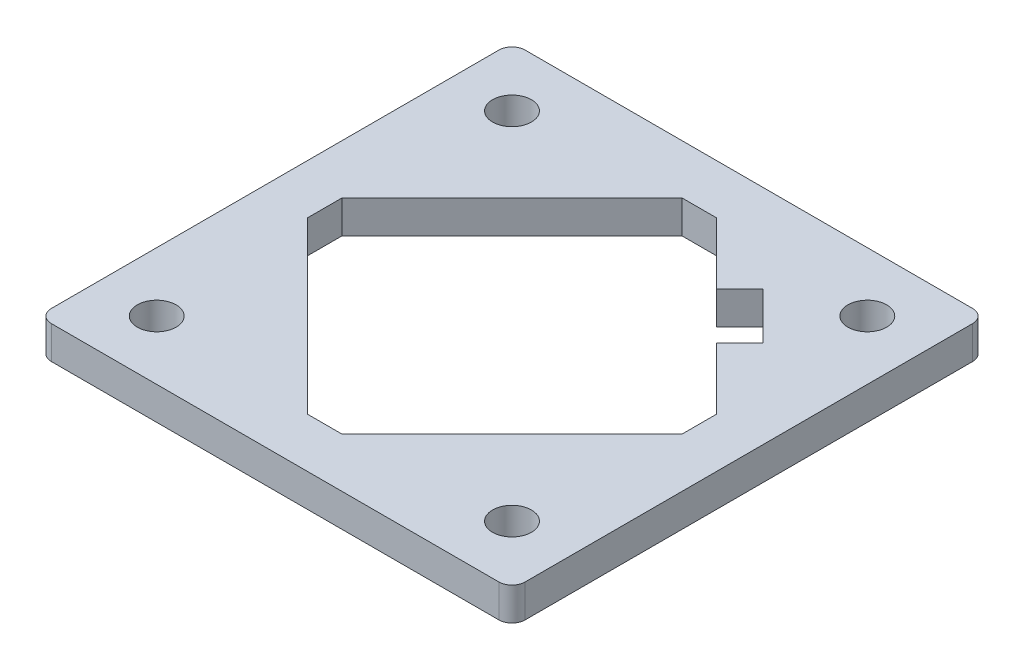
ISO-10303-21;
HEADER;
FILE_DESCRIPTION(('STEP AP214'),'2;1');
FILE_NAME('part.step','',(''),(''),'','','');
FILE_SCHEMA(('AUTOMOTIVE_DESIGN { 1 0 10303 214 1 1 1 1 }'));
ENDSEC;
DATA;
#1=APPLICATION_CONTEXT('core data for automotive mechanical design processes');
#2=APPLICATION_PROTOCOL_DEFINITION('international standard','automotive_design',2000,#1);
#3=PRODUCT_CONTEXT('',#1,'mechanical');
#4=PRODUCT('Part','Part','',(#3));
#5=PRODUCT_RELATED_PRODUCT_CATEGORY('part','',(#4));
#6=PRODUCT_DEFINITION_FORMATION('','',#4);
#7=PRODUCT_DEFINITION_CONTEXT('part definition',#1,'design');
#8=PRODUCT_DEFINITION('design','',#6,#7);
#9=PRODUCT_DEFINITION_SHAPE('','',#8);
#10=(LENGTH_UNIT() NAMED_UNIT(*) SI_UNIT(.MILLI.,.METRE.));
#11=(NAMED_UNIT(*) PLANE_ANGLE_UNIT() SI_UNIT($,.RADIAN.));
#12=(NAMED_UNIT(*) SI_UNIT($,.STERADIAN.) SOLID_ANGLE_UNIT());
#13=UNCERTAINTY_MEASURE_WITH_UNIT(LENGTH_MEASURE(1.E-05),#10,'distance_accuracy_value','');
#14=(GEOMETRIC_REPRESENTATION_CONTEXT(3) GLOBAL_UNCERTAINTY_ASSIGNED_CONTEXT((#13)) GLOBAL_UNIT_ASSIGNED_CONTEXT((#10,
#11,#12)) REPRESENTATION_CONTEXT('',''));
#15=CARTESIAN_POINT('',(0.,0.,0.));
#16=DIRECTION('',(0.,0.,1.));
#17=DIRECTION('',(1.,0.,0.));
#18=AXIS2_PLACEMENT_3D('',#15,#16,#17);
#19=CARTESIAN_POINT('',(0.,5.,0.));
#20=DIRECTION('',(0.,-1.,0.));
#21=DIRECTION('',(0.,0.,-1.));
#22=AXIS2_PLACEMENT_3D('',#19,#20,#21);
#23=PLANE('',#22);
#24=DIRECTION('',(0.,0.,1.));
#25=VECTOR('',#24,1.);
#26=CARTESIAN_POINT('',(-36.,5.,36.));
#27=LINE('',#26,#25);
#28=CARTESIAN_POINT('',(-36.,5.,-34.));
#29=VERTEX_POINT('',#28);
#30=CARTESIAN_POINT('',(-36.,5.,34.));
#31=VERTEX_POINT('',#30);
#32=EDGE_CURVE('E323',#29,#31,#27,.T.);
#33=ORIENTED_EDGE('',*,*,#32,.T.);
#34=CARTESIAN_POINT('',(-34.,5.,34.));
#35=DIRECTION('',(0.,-1.,0.));
#36=DIRECTION('',(0.,0.,-1.));
#37=AXIS2_PLACEMENT_3D('',#34,#35,#36);
#38=CIRCLE('',#37,2.);
#39=CARTESIAN_POINT('',(-34.,5.,36.));
#40=VERTEX_POINT('',#39);
#41=EDGE_CURVE('E378',#31,#40,#38,.F.);
#42=ORIENTED_EDGE('',*,*,#41,.T.);
#43=DIRECTION('',(1.,0.,0.));
#44=VECTOR('',#43,1.);
#45=CARTESIAN_POINT('',(-36.,5.,36.));
#46=LINE('',#45,#44);
#47=CARTESIAN_POINT('',(34.,5.,36.));
#48=VERTEX_POINT('',#47);
#49=EDGE_CURVE('E327',#40,#48,#46,.T.);
#50=ORIENTED_EDGE('',*,*,#49,.T.);
#51=CARTESIAN_POINT('',(34.,5.,34.));
#52=DIRECTION('',(0.,-1.,0.));
#53=DIRECTION('',(0.,0.,-1.));
#54=AXIS2_PLACEMENT_3D('',#51,#52,#53);
#55=CIRCLE('',#54,2.);
#56=CARTESIAN_POINT('',(36.,5.,34.));
#57=VERTEX_POINT('',#56);
#58=EDGE_CURVE('E375',#48,#57,#55,.F.);
#59=ORIENTED_EDGE('',*,*,#58,.T.);
#60=DIRECTION('',(0.,0.,-1.));
#61=VECTOR('',#60,1.);
#62=CARTESIAN_POINT('',(36.,5.,36.));
#63=LINE('',#62,#61);
#64=CARTESIAN_POINT('',(36.,5.,-34.));
#65=VERTEX_POINT('',#64);
#66=EDGE_CURVE('E316',#57,#65,#63,.T.);
#67=ORIENTED_EDGE('',*,*,#66,.T.);
#68=CARTESIAN_POINT('',(34.,5.,-34.));
#69=DIRECTION('',(0.,-1.,0.));
#70=DIRECTION('',(0.,0.,-1.));
#71=AXIS2_PLACEMENT_3D('',#68,#69,#70);
#72=CIRCLE('',#71,2.);
#73=CARTESIAN_POINT('',(34.,5.,-36.));
#74=VERTEX_POINT('',#73);
#75=EDGE_CURVE('E61',#65,#74,#72,.F.);
#76=ORIENTED_EDGE('',*,*,#75,.T.);
#77=DIRECTION('',(-1.,0.,0.));
#78=VECTOR('',#77,1.);
#79=CARTESIAN_POINT('',(-36.,5.,-36.));
#80=LINE('',#79,#78);
#81=CARTESIAN_POINT('',(-34.,5.,-36.));
#82=VERTEX_POINT('',#81);
#83=EDGE_CURVE('E319',#74,#82,#80,.T.);
#84=ORIENTED_EDGE('',*,*,#83,.T.);
#85=CARTESIAN_POINT('',(-34.,5.,-34.));
#86=DIRECTION('',(0.,-1.,0.));
#87=DIRECTION('',(0.,0.,-1.));
#88=AXIS2_PLACEMENT_3D('',#85,#86,#87);
#89=CIRCLE('',#88,2.);
#90=EDGE_CURVE('E370',#82,#29,#89,.F.);
#91=ORIENTED_EDGE('',*,*,#90,.T.);
#92=EDGE_LOOP('',(#33,#42,#50,#59,#67,#76,#84,#91));
#93=FACE_BOUND('',#92,.T.);
#94=DIRECTION('',(-0.707106781186548,0.,-0.707106781186547));
#95=VECTOR('',#94,1.);
#96=CARTESIAN_POINT('',(12.0208152801713,5.,-19.0918830920368));
#97=LINE('',#96,#95);
#98=CARTESIAN_POINT('',(12.0208152801713,5.,-19.0918830920368));
#99=VERTEX_POINT('',#98);
#100=CARTESIAN_POINT('',(2.65165042944955,5.,-28.4610479427585));
#101=VERTEX_POINT('',#100);
#102=EDGE_CURVE('E179',#99,#101,#97,.T.);
#103=ORIENTED_EDGE('',*,*,#102,.F.);
#104=DIRECTION('',(-0.707106781186548,0.,0.707106781186547));
#105=VECTOR('',#104,1.);
#106=CARTESIAN_POINT('',(12.0208152801713,5.,-19.0918830920368));
#107=LINE('',#106,#105);
#108=CARTESIAN_POINT('',(15.5563491861041,5.,-22.6274169979695));
#109=VERTEX_POINT('',#108);
#110=EDGE_CURVE('E237',#109,#99,#107,.T.);
#111=ORIENTED_EDGE('',*,*,#110,.F.);
#112=DIRECTION('',(-0.707106781186548,0.,-0.707106781186547));
#113=VECTOR('',#112,1.);
#114=CARTESIAN_POINT('',(15.5563491861041,5.,-22.6274169979695));
#115=LINE('',#114,#113);
#116=CARTESIAN_POINT('',(22.6274169979695,5.,-15.5563491861041));
#117=VERTEX_POINT('',#116);
#118=EDGE_CURVE('E233',#117,#109,#115,.T.);
#119=ORIENTED_EDGE('',*,*,#118,.F.);
#120=DIRECTION('',(0.707106781186549,0.,-0.707106781186546));
#121=VECTOR('',#120,1.);
#122=CARTESIAN_POINT('',(22.6274169979695,5.,-15.5563491861041));
#123=LINE('',#122,#121);
#124=CARTESIAN_POINT('',(19.0918830920368,5.,-12.0208152801713));
#125=VERTEX_POINT('',#124);
#126=EDGE_CURVE('E230',#125,#117,#123,.T.);
#127=ORIENTED_EDGE('',*,*,#126,.F.);
#128=DIRECTION('',(-0.707106781186547,0.,-0.707106781186548));
#129=VECTOR('',#128,1.);
#130=CARTESIAN_POINT('',(28.4610479427585,5.,-2.65165042944955));
#131=LINE('',#130,#129);
#132=CARTESIAN_POINT('',(28.4610479427585,5.,-2.65165042944955));
#133=VERTEX_POINT('',#132);
#134=EDGE_CURVE('E227',#133,#125,#131,.T.);
#135=ORIENTED_EDGE('',*,*,#134,.F.);
#136=DIRECTION('',(0.,0.,-1.));
#137=VECTOR('',#136,1.);
#138=CARTESIAN_POINT('',(28.4610479427585,5.,2.65165042944955));
#139=LINE('',#138,#137);
#140=CARTESIAN_POINT('',(28.4610479427585,5.,2.65165042944955));
#141=VERTEX_POINT('',#140);
#142=EDGE_CURVE('E224',#141,#133,#139,.T.);
#143=ORIENTED_EDGE('',*,*,#142,.F.);
#144=DIRECTION('',(0.707106781186547,0.,-0.707106781186547));
#145=VECTOR('',#144,1.);
#146=CARTESIAN_POINT('',(2.65165042944955,5.,28.4610479427585));
#147=LINE('',#146,#145);
#148=CARTESIAN_POINT('',(2.65165042944955,5.,28.4610479427585));
#149=VERTEX_POINT('',#148);
#150=EDGE_CURVE('E221',#149,#141,#147,.T.);
#151=ORIENTED_EDGE('',*,*,#150,.F.);
#152=DIRECTION('',(1.,0.,0.));
#153=VECTOR('',#152,1.);
#154=CARTESIAN_POINT('',(-2.65165042944955,5.,28.4610479427585));
#155=LINE('',#154,#153);
#156=CARTESIAN_POINT('',(-2.65165042944955,5.,28.4610479427585));
#157=VERTEX_POINT('',#156);
#158=EDGE_CURVE('E218',#157,#149,#155,.T.);
#159=ORIENTED_EDGE('',*,*,#158,.F.);
#160=DIRECTION('',(0.707106781186547,0.,0.707106781186547));
#161=VECTOR('',#160,1.);
#162=CARTESIAN_POINT('',(-28.4610479427585,5.,2.65165042944955));
#163=LINE('',#162,#161);
#164=CARTESIAN_POINT('',(-28.4610479427585,5.,2.65165042944955));
#165=VERTEX_POINT('',#164);
#166=EDGE_CURVE('E215',#165,#157,#163,.T.);
#167=ORIENTED_EDGE('',*,*,#166,.F.);
#168=DIRECTION('',(0.,0.,1.));
#169=VECTOR('',#168,1.);
#170=CARTESIAN_POINT('',(-28.4610479427585,5.,-2.65165042944955));
#171=LINE('',#170,#169);
#172=CARTESIAN_POINT('',(-28.4610479427585,5.,-2.65165042944955));
#173=VERTEX_POINT('',#172);
#174=EDGE_CURVE('E209',#173,#165,#171,.T.);
#175=ORIENTED_EDGE('',*,*,#174,.F.);
#176=DIRECTION('',(-0.707106781186547,0.,0.707106781186547));
#177=VECTOR('',#176,1.);
#178=CARTESIAN_POINT('',(-2.65165042944955,5.,-28.4610479427585));
#179=LINE('',#178,#177);
#180=CARTESIAN_POINT('',(-2.65165042944955,5.,-28.4610479427585));
#181=VERTEX_POINT('',#180);
#182=EDGE_CURVE('E205',#181,#173,#179,.T.);
#183=ORIENTED_EDGE('',*,*,#182,.F.);
#184=DIRECTION('',(-1.,0.,0.));
#185=VECTOR('',#184,1.);
#186=CARTESIAN_POINT('',(-2.65165042944955,5.,-28.4610479427585));
#187=LINE('',#186,#185);
#188=EDGE_CURVE('E190',#101,#181,#187,.T.);
#189=ORIENTED_EDGE('',*,*,#188,.F.);
#190=EDGE_LOOP('',(#103,#111,#119,#127,#135,#143,#151,#159,#167,#175,#183,#189));
#191=FACE_BOUND('',#190,.T.);
#192=CARTESIAN_POINT('',(-27.,5.,-27.));
#193=DIRECTION('',(0.,1.,0.));
#194=DIRECTION('',(0.,0.,1.));
#195=AXIS2_PLACEMENT_3D('',#192,#193,#194);
#196=CIRCLE('',#195,2.95);
#197=CARTESIAN_POINT('',(-27.,5.,-24.05));
#198=VERTEX_POINT('',#197);
#199=EDGE_CURVE('E243',#198,#198,#196,.T.);
#200=ORIENTED_EDGE('',*,*,#199,.F.);
#201=EDGE_LOOP('',(#200));
#202=FACE_BOUND('',#201,.T.);
#203=CARTESIAN_POINT('',(27.,5.,27.));
#204=DIRECTION('',(0.,1.,0.));
#205=DIRECTION('',(0.,0.,1.));
#206=AXIS2_PLACEMENT_3D('',#203,#204,#205);
#207=CIRCLE('',#206,2.95);
#208=CARTESIAN_POINT('',(27.,5.,29.95));
#209=VERTEX_POINT('',#208);
#210=EDGE_CURVE('E679',#209,#209,#207,.T.);
#211=ORIENTED_EDGE('',*,*,#210,.F.);
#212=EDGE_LOOP('',(#211));
#213=FACE_BOUND('',#212,.T.);
#214=CARTESIAN_POINT('',(-27.,5.,27.));
#215=DIRECTION('',(0.,1.,0.));
#216=DIRECTION('',(0.,0.,1.));
#217=AXIS2_PLACEMENT_3D('',#214,#215,#216);
#218=CIRCLE('',#217,2.95);
#219=CARTESIAN_POINT('',(-27.,5.,29.95));
#220=VERTEX_POINT('',#219);
#221=EDGE_CURVE('E671',#220,#220,#218,.T.);
#222=ORIENTED_EDGE('',*,*,#221,.F.);
#223=EDGE_LOOP('',(#222));
#224=FACE_BOUND('',#223,.T.);
#225=CARTESIAN_POINT('',(27.,5.,-27.));
#226=DIRECTION('',(0.,1.,0.));
#227=DIRECTION('',(0.,0.,1.));
#228=AXIS2_PLACEMENT_3D('',#225,#226,#227);
#229=CIRCLE('',#228,2.95000000000001);
#230=CARTESIAN_POINT('',(27.,5.,-24.05));
#231=VERTEX_POINT('',#230);
#232=EDGE_CURVE('E660',#231,#231,#229,.T.);
#233=ORIENTED_EDGE('',*,*,#232,.F.);
#234=EDGE_LOOP('',(#233));
#235=FACE_BOUND('',#234,.T.);
#236=ADVANCED_FACE('F39',(#93,#191,#202,#213,#224,#235),#23,.F.);
#237=CARTESIAN_POINT('',(0.,0.,0.));
#238=DIRECTION('',(0.,-1.,0.));
#239=DIRECTION('',(0.,0.,-1.));
#240=AXIS2_PLACEMENT_3D('',#237,#238,#239);
#241=PLANE('',#240);
#242=CARTESIAN_POINT('',(-27.,0.,27.));
#243=DIRECTION('',(0.,1.,0.));
#244=DIRECTION('',(0.,0.,1.));
#245=AXIS2_PLACEMENT_3D('',#242,#243,#244);
#246=CIRCLE('',#245,2.95);
#247=CARTESIAN_POINT('',(-27.,0.,29.95));
#248=VERTEX_POINT('',#247);
#249=EDGE_CURVE('E668',#248,#248,#246,.T.);
#250=ORIENTED_EDGE('',*,*,#249,.T.);
#251=EDGE_LOOP('',(#250));
#252=FACE_BOUND('',#251,.T.);
#253=CARTESIAN_POINT('',(-27.,0.,-27.));
#254=DIRECTION('',(0.,1.,0.));
#255=DIRECTION('',(0.,0.,1.));
#256=AXIS2_PLACEMENT_3D('',#253,#254,#255);
#257=CIRCLE('',#256,2.95);
#258=CARTESIAN_POINT('',(-27.,0.,-24.05));
#259=VERTEX_POINT('',#258);
#260=EDGE_CURVE('E683',#259,#259,#257,.T.);
#261=ORIENTED_EDGE('',*,*,#260,.T.);
#262=EDGE_LOOP('',(#261));
#263=FACE_BOUND('',#262,.T.);
#264=DIRECTION('',(1.,0.,0.));
#265=VECTOR('',#264,1.);
#266=CARTESIAN_POINT('',(-36.,0.,36.));
#267=LINE('',#266,#265);
#268=CARTESIAN_POINT('',(-34.,0.,36.));
#269=VERTEX_POINT('',#268);
#270=CARTESIAN_POINT('',(34.,0.,36.));
#271=VERTEX_POINT('',#270);
#272=EDGE_CURVE('E320',#269,#271,#267,.T.);
#273=ORIENTED_EDGE('',*,*,#272,.F.);
#274=CARTESIAN_POINT('',(-34.,0.,34.));
#275=DIRECTION('',(0.,-1.,0.));
#276=DIRECTION('',(0.,0.,-1.));
#277=AXIS2_PLACEMENT_3D('',#274,#275,#276);
#278=CIRCLE('',#277,2.);
#279=CARTESIAN_POINT('',(-36.,0.,34.));
#280=VERTEX_POINT('',#279);
#281=EDGE_CURVE('E360',#269,#280,#278,.T.);
#282=ORIENTED_EDGE('',*,*,#281,.T.);
#283=DIRECTION('',(0.,0.,1.));
#284=VECTOR('',#283,1.);
#285=CARTESIAN_POINT('',(-36.,0.,36.));
#286=LINE('',#285,#284);
#287=CARTESIAN_POINT('',(-36.,0.,-34.));
#288=VERTEX_POINT('',#287);
#289=EDGE_CURVE('E338',#288,#280,#286,.T.);
#290=ORIENTED_EDGE('',*,*,#289,.F.);
#291=CARTESIAN_POINT('',(-34.,0.,-34.));
#292=DIRECTION('',(0.,-1.,0.));
#293=DIRECTION('',(0.,0.,-1.));
#294=AXIS2_PLACEMENT_3D('',#291,#292,#293);
#295=CIRCLE('',#294,2.);
#296=CARTESIAN_POINT('',(-34.,0.,-36.));
#297=VERTEX_POINT('',#296);
#298=EDGE_CURVE('E351',#288,#297,#295,.T.);
#299=ORIENTED_EDGE('',*,*,#298,.T.);
#300=DIRECTION('',(-1.,0.,0.));
#301=VECTOR('',#300,1.);
#302=CARTESIAN_POINT('',(-36.,0.,-36.));
#303=LINE('',#302,#301);
#304=CARTESIAN_POINT('',(34.,0.,-36.));
#305=VERTEX_POINT('',#304);
#306=EDGE_CURVE('E335',#305,#297,#303,.T.);
#307=ORIENTED_EDGE('',*,*,#306,.F.);
#308=CARTESIAN_POINT('',(34.,0.,-34.));
#309=DIRECTION('',(0.,-1.,0.));
#310=DIRECTION('',(0.,0.,-1.));
#311=AXIS2_PLACEMENT_3D('',#308,#309,#310);
#312=CIRCLE('',#311,2.);
#313=CARTESIAN_POINT('',(36.,0.,-34.));
#314=VERTEX_POINT('',#313);
#315=EDGE_CURVE('E354',#305,#314,#312,.T.);
#316=ORIENTED_EDGE('',*,*,#315,.T.);
#317=DIRECTION('',(0.,0.,-1.));
#318=VECTOR('',#317,1.);
#319=CARTESIAN_POINT('',(36.,0.,36.));
#320=LINE('',#319,#318);
#321=CARTESIAN_POINT('',(36.,0.,34.));
#322=VERTEX_POINT('',#321);
#323=EDGE_CURVE('E199',#322,#314,#320,.T.);
#324=ORIENTED_EDGE('',*,*,#323,.F.);
#325=CARTESIAN_POINT('',(34.,0.,34.));
#326=DIRECTION('',(0.,-1.,0.));
#327=DIRECTION('',(0.,0.,-1.));
#328=AXIS2_PLACEMENT_3D('',#325,#326,#327);
#329=CIRCLE('',#328,2.);
#330=EDGE_CURVE('E357',#322,#271,#329,.T.);
#331=ORIENTED_EDGE('',*,*,#330,.T.);
#332=EDGE_LOOP('',(#273,#282,#290,#299,#307,#316,#324,#331));
#333=FACE_BOUND('',#332,.T.);
#334=DIRECTION('',(-0.707106781186548,0.,0.707106781186547));
#335=VECTOR('',#334,1.);
#336=CARTESIAN_POINT('',(12.0208152801713,0.,-19.0918830920368));
#337=LINE('',#336,#335);
#338=CARTESIAN_POINT('',(15.5563491861041,0.,-22.6274169979695));
#339=VERTEX_POINT('',#338);
#340=CARTESIAN_POINT('',(12.0208152801713,0.,-19.0918830920368));
#341=VERTEX_POINT('',#340);
#342=EDGE_CURVE('E191',#339,#341,#337,.T.);
#343=ORIENTED_EDGE('',*,*,#342,.T.);
#344=DIRECTION('',(-0.707106781186548,0.,-0.707106781186547));
#345=VECTOR('',#344,1.);
#346=CARTESIAN_POINT('',(12.0208152801713,0.,-19.0918830920368));
#347=LINE('',#346,#345);
#348=CARTESIAN_POINT('',(2.65165042944955,0.,-28.4610479427585));
#349=VERTEX_POINT('',#348);
#350=EDGE_CURVE('E240',#341,#349,#347,.T.);
#351=ORIENTED_EDGE('',*,*,#350,.T.);
#352=DIRECTION('',(-1.,0.,0.));
#353=VECTOR('',#352,1.);
#354=CARTESIAN_POINT('',(-2.65165042944955,0.,-28.4610479427585));
#355=LINE('',#354,#353);
#356=CARTESIAN_POINT('',(-2.65165042944955,0.,-28.4610479427585));
#357=VERTEX_POINT('',#356);
#358=EDGE_CURVE('E197',#349,#357,#355,.T.);
#359=ORIENTED_EDGE('',*,*,#358,.T.);
#360=DIRECTION('',(-0.707106781186547,0.,0.707106781186547));
#361=VECTOR('',#360,1.);
#362=CARTESIAN_POINT('',(-2.65165042944955,0.,-28.4610479427585));
#363=LINE('',#362,#361);
#364=CARTESIAN_POINT('',(-28.4610479427585,0.,-2.65165042944955));
#365=VERTEX_POINT('',#364);
#366=EDGE_CURVE('E246',#357,#365,#363,.T.);
#367=ORIENTED_EDGE('',*,*,#366,.T.);
#368=DIRECTION('',(0.,0.,1.));
#369=VECTOR('',#368,1.);
#370=CARTESIAN_POINT('',(-28.4610479427585,0.,-2.65165042944955));
#371=LINE('',#370,#369);
#372=CARTESIAN_POINT('',(-28.4610479427585,0.,2.65165042944955));
#373=VERTEX_POINT('',#372);
#374=EDGE_CURVE('E250',#365,#373,#371,.T.);
#375=ORIENTED_EDGE('',*,*,#374,.T.);
#376=DIRECTION('',(0.707106781186547,0.,0.707106781186547));
#377=VECTOR('',#376,1.);
#378=CARTESIAN_POINT('',(-28.4610479427585,0.,2.65165042944955));
#379=LINE('',#378,#377);
#380=CARTESIAN_POINT('',(-2.65165042944955,0.,28.4610479427585));
#381=VERTEX_POINT('',#380);
#382=EDGE_CURVE('E254',#373,#381,#379,.T.);
#383=ORIENTED_EDGE('',*,*,#382,.T.);
#384=DIRECTION('',(1.,0.,0.));
#385=VECTOR('',#384,1.);
#386=CARTESIAN_POINT('',(-2.65165042944955,0.,28.4610479427585));
#387=LINE('',#386,#385);
#388=CARTESIAN_POINT('',(2.65165042944955,0.,28.4610479427585));
#389=VERTEX_POINT('',#388);
#390=EDGE_CURVE('E258',#381,#389,#387,.T.);
#391=ORIENTED_EDGE('',*,*,#390,.T.);
#392=DIRECTION('',(0.707106781186547,0.,-0.707106781186547));
#393=VECTOR('',#392,1.);
#394=CARTESIAN_POINT('',(2.65165042944955,0.,28.4610479427585));
#395=LINE('',#394,#393);
#396=CARTESIAN_POINT('',(28.4610479427585,0.,2.65165042944955));
#397=VERTEX_POINT('',#396);
#398=EDGE_CURVE('E262',#389,#397,#395,.T.);
#399=ORIENTED_EDGE('',*,*,#398,.T.);
#400=DIRECTION('',(0.,0.,-1.));
#401=VECTOR('',#400,1.);
#402=CARTESIAN_POINT('',(28.4610479427585,0.,2.65165042944955));
#403=LINE('',#402,#401);
#404=CARTESIAN_POINT('',(28.4610479427585,0.,-2.65165042944955));
#405=VERTEX_POINT('',#404);
#406=EDGE_CURVE('E266',#397,#405,#403,.T.);
#407=ORIENTED_EDGE('',*,*,#406,.T.);
#408=DIRECTION('',(-0.707106781186547,0.,-0.707106781186548));
#409=VECTOR('',#408,1.);
#410=CARTESIAN_POINT('',(28.4610479427585,0.,-2.65165042944955));
#411=LINE('',#410,#409);
#412=CARTESIAN_POINT('',(19.0918830920368,0.,-12.0208152801713));
#413=VERTEX_POINT('',#412);
#414=EDGE_CURVE('E270',#405,#413,#411,.T.);
#415=ORIENTED_EDGE('',*,*,#414,.T.);
#416=DIRECTION('',(0.707106781186549,0.,-0.707106781186546));
#417=VECTOR('',#416,1.);
#418=CARTESIAN_POINT('',(22.6274169979695,0.,-15.5563491861041));
#419=LINE('',#418,#417);
#420=CARTESIAN_POINT('',(22.6274169979695,0.,-15.5563491861041));
#421=VERTEX_POINT('',#420);
#422=EDGE_CURVE('E274',#413,#421,#419,.T.);
#423=ORIENTED_EDGE('',*,*,#422,.T.);
#424=DIRECTION('',(-0.707106781186548,0.,-0.707106781186547));
#425=VECTOR('',#424,1.);
#426=CARTESIAN_POINT('',(15.5563491861041,0.,-22.6274169979695));
#427=LINE('',#426,#425);
#428=EDGE_CURVE('E278',#421,#339,#427,.T.);
#429=ORIENTED_EDGE('',*,*,#428,.T.);
#430=EDGE_LOOP('',(#343,#351,#359,#367,#375,#383,#391,#399,#407,#415,#423,#429));
#431=FACE_BOUND('',#430,.T.);
#432=CARTESIAN_POINT('',(27.,0.,27.));
#433=DIRECTION('',(0.,1.,0.));
#434=DIRECTION('',(0.,0.,1.));
#435=AXIS2_PLACEMENT_3D('',#432,#433,#434);
#436=CIRCLE('',#435,2.95);
#437=CARTESIAN_POINT('',(27.,0.,29.95));
#438=VERTEX_POINT('',#437);
#439=EDGE_CURVE('E675',#438,#438,#436,.T.);
#440=ORIENTED_EDGE('',*,*,#439,.T.);
#441=EDGE_LOOP('',(#440));
#442=FACE_BOUND('',#441,.T.);
#443=CARTESIAN_POINT('',(27.,0.,-27.));
#444=DIRECTION('',(0.,1.,0.));
#445=DIRECTION('',(0.,0.,1.));
#446=AXIS2_PLACEMENT_3D('',#443,#444,#445);
#447=CIRCLE('',#446,2.95000000000001);
#448=CARTESIAN_POINT('',(27.,0.,-24.05));
#449=VERTEX_POINT('',#448);
#450=EDGE_CURVE('E663',#449,#449,#447,.T.);
#451=ORIENTED_EDGE('',*,*,#450,.T.);
#452=EDGE_LOOP('',(#451));
#453=FACE_BOUND('',#452,.T.);
#454=ADVANCED_FACE('F398',(#252,#263,#333,#431,#442,#453),#241,.T.);
#455=CARTESIAN_POINT('',(36.,5.,36.));
#456=DIRECTION('',(-1.,0.,0.));
#457=DIRECTION('',(0.,0.,1.));
#458=AXIS2_PLACEMENT_3D('',#455,#456,#457);
#459=PLANE('',#458);
#460=ORIENTED_EDGE('',*,*,#66,.F.);
#461=DIRECTION('',(0.,-1.,0.));
#462=VECTOR('',#461,1.);
#463=CARTESIAN_POINT('',(36.,5.,34.));
#464=LINE('',#463,#462);
#465=EDGE_CURVE('E384',#57,#322,#464,.T.);
#466=ORIENTED_EDGE('',*,*,#465,.T.);
#467=ORIENTED_EDGE('',*,*,#323,.T.);
#468=DIRECTION('',(0.,-1.,0.));
#469=VECTOR('',#468,1.);
#470=CARTESIAN_POINT('',(36.,5.,-34.));
#471=LINE('',#470,#469);
#472=EDGE_CURVE('E381',#314,#65,#471,.F.);
#473=ORIENTED_EDGE('',*,*,#472,.T.);
#474=EDGE_LOOP('',(#460,#466,#467,#473));
#475=FACE_BOUND('',#474,.T.);
#476=ADVANCED_FACE('F392',(#475),#459,.F.);
#477=CARTESIAN_POINT('',(-36.,5.,-36.));
#478=DIRECTION('',(0.,0.,1.));
#479=DIRECTION('',(1.,0.,0.));
#480=AXIS2_PLACEMENT_3D('',#477,#478,#479);
#481=PLANE('',#480);
#482=ORIENTED_EDGE('',*,*,#83,.F.);
#483=DIRECTION('',(0.,-1.,0.));
#484=VECTOR('',#483,1.);
#485=CARTESIAN_POINT('',(34.,5.,-36.));
#486=LINE('',#485,#484);
#487=EDGE_CURVE('E11',#74,#305,#486,.T.);
#488=ORIENTED_EDGE('',*,*,#487,.T.);
#489=ORIENTED_EDGE('',*,*,#306,.T.);
#490=DIRECTION('',(0.,-1.,0.));
#491=VECTOR('',#490,1.);
#492=CARTESIAN_POINT('',(-34.,5.,-36.));
#493=LINE('',#492,#491);
#494=EDGE_CURVE('E48',#297,#82,#493,.F.);
#495=ORIENTED_EDGE('',*,*,#494,.T.);
#496=EDGE_LOOP('',(#482,#488,#489,#495));
#497=FACE_BOUND('',#496,.T.);
#498=ADVANCED_FACE('F404',(#497),#481,.F.);
#499=CARTESIAN_POINT('',(-36.,5.,36.));
#500=DIRECTION('',(1.,0.,0.));
#501=DIRECTION('',(0.,0.,-1.));
#502=AXIS2_PLACEMENT_3D('',#499,#500,#501);
#503=PLANE('',#502);
#504=ORIENTED_EDGE('',*,*,#289,.T.);
#505=DIRECTION('',(0.,-1.,0.));
#506=VECTOR('',#505,1.);
#507=CARTESIAN_POINT('',(-36.,5.,34.));
#508=LINE('',#507,#506);
#509=EDGE_CURVE('E367',#280,#31,#508,.F.);
#510=ORIENTED_EDGE('',*,*,#509,.T.);
#511=ORIENTED_EDGE('',*,*,#32,.F.);
#512=DIRECTION('',(0.,-1.,0.));
#513=VECTOR('',#512,1.);
#514=CARTESIAN_POINT('',(-36.,5.,-34.));
#515=LINE('',#514,#513);
#516=EDGE_CURVE('E363',#29,#288,#515,.T.);
#517=ORIENTED_EDGE('',*,*,#516,.T.);
#518=EDGE_LOOP('',(#504,#510,#511,#517));
#519=FACE_BOUND('',#518,.T.);
#520=ADVANCED_FACE('F411',(#519),#503,.F.);
#521=CARTESIAN_POINT('',(-36.,5.,36.));
#522=DIRECTION('',(0.,0.,-1.));
#523=DIRECTION('',(-1.,0.,0.));
#524=AXIS2_PLACEMENT_3D('',#521,#522,#523);
#525=PLANE('',#524);
#526=ORIENTED_EDGE('',*,*,#49,.F.);
#527=DIRECTION('',(0.,-1.,0.));
#528=VECTOR('',#527,1.);
#529=CARTESIAN_POINT('',(-34.,5.,36.));
#530=LINE('',#529,#528);
#531=EDGE_CURVE('E347',#40,#269,#530,.T.);
#532=ORIENTED_EDGE('',*,*,#531,.T.);
#533=ORIENTED_EDGE('',*,*,#272,.T.);
#534=DIRECTION('',(0.,-1.,0.));
#535=VECTOR('',#534,1.);
#536=CARTESIAN_POINT('',(34.,5.,36.));
#537=LINE('',#536,#535);
#538=EDGE_CURVE('E331',#271,#48,#537,.F.);
#539=ORIENTED_EDGE('',*,*,#538,.T.);
#540=EDGE_LOOP('',(#526,#532,#533,#539));
#541=FACE_BOUND('',#540,.T.);
#542=ADVANCED_FACE('F419',(#541),#525,.F.);
#543=CARTESIAN_POINT('',(12.0208152801713,5.,-19.0918830920368));
#544=DIRECTION('',(-0.707106781186547,0.,0.707106781186548));
#545=DIRECTION('',(0.707106781186548,0.,0.707106781186547));
#546=AXIS2_PLACEMENT_3D('',#543,#544,#545);
#547=PLANE('',#546);
#548=ORIENTED_EDGE('',*,*,#350,.F.);
#549=DIRECTION('',(0.,-1.,0.));
#550=VECTOR('',#549,1.);
#551=CARTESIAN_POINT('',(12.0208152801713,5.,-19.0918830920368));
#552=LINE('',#551,#550);
#553=EDGE_CURVE('E185',#99,#341,#552,.T.);
#554=ORIENTED_EDGE('',*,*,#553,.F.);
#555=ORIENTED_EDGE('',*,*,#102,.T.);
#556=DIRECTION('',(0.,-1.,0.));
#557=VECTOR('',#556,1.);
#558=CARTESIAN_POINT('',(2.65165042944955,5.,-28.4610479427585));
#559=LINE('',#558,#557);
#560=EDGE_CURVE('E182',#101,#349,#559,.T.);
#561=ORIENTED_EDGE('',*,*,#560,.T.);
#562=EDGE_LOOP('',(#548,#554,#555,#561));
#563=FACE_BOUND('',#562,.T.);
#564=ADVANCED_FACE('F181',(#563),#547,.T.);
#565=CARTESIAN_POINT('',(-2.65165042944955,5.,-28.4610479427585));
#566=DIRECTION('',(0.,0.,1.));
#567=DIRECTION('',(1.,0.,0.));
#568=AXIS2_PLACEMENT_3D('',#565,#566,#567);
#569=PLANE('',#568);
#570=ORIENTED_EDGE('',*,*,#358,.F.);
#571=ORIENTED_EDGE('',*,*,#560,.F.);
#572=ORIENTED_EDGE('',*,*,#188,.T.);
#573=DIRECTION('',(0.,-1.,0.));
#574=VECTOR('',#573,1.);
#575=CARTESIAN_POINT('',(-2.65165042944955,5.,-28.4610479427585));
#576=LINE('',#575,#574);
#577=EDGE_CURVE('E200',#181,#357,#576,.T.);
#578=ORIENTED_EDGE('',*,*,#577,.T.);
#579=EDGE_LOOP('',(#570,#571,#572,#578));
#580=FACE_BOUND('',#579,.T.);
#581=ADVANCED_FACE('F194',(#580),#569,.T.);
#582=CARTESIAN_POINT('',(-2.65165042944955,5.,-28.4610479427585));
#583=DIRECTION('',(0.707106781186547,0.,0.707106781186548));
#584=DIRECTION('',(0.707106781186548,0.,-0.707106781186547));
#585=AXIS2_PLACEMENT_3D('',#582,#583,#584);
#586=PLANE('',#585);
#587=ORIENTED_EDGE('',*,*,#366,.F.);
#588=ORIENTED_EDGE('',*,*,#577,.F.);
#589=ORIENTED_EDGE('',*,*,#182,.T.);
#590=DIRECTION('',(0.,-1.,0.));
#591=VECTOR('',#590,1.);
#592=CARTESIAN_POINT('',(-28.4610479427585,5.,-2.65165042944955));
#593=LINE('',#592,#591);
#594=EDGE_CURVE('E311',#173,#365,#593,.T.);
#595=ORIENTED_EDGE('',*,*,#594,.T.);
#596=EDGE_LOOP('',(#587,#588,#589,#595));
#597=FACE_BOUND('',#596,.T.);
#598=ADVANCED_FACE('F475',(#597),#586,.T.);
#599=CARTESIAN_POINT('',(-28.4610479427585,5.,-2.65165042944955));
#600=DIRECTION('',(1.,0.,0.));
#601=DIRECTION('',(0.,0.,-1.));
#602=AXIS2_PLACEMENT_3D('',#599,#600,#601);
#603=PLANE('',#602);
#604=ORIENTED_EDGE('',*,*,#374,.F.);
#605=ORIENTED_EDGE('',*,*,#594,.F.);
#606=ORIENTED_EDGE('',*,*,#174,.T.);
#607=DIRECTION('',(0.,-1.,0.));
#608=VECTOR('',#607,1.);
#609=CARTESIAN_POINT('',(-28.4610479427585,5.,2.65165042944955));
#610=LINE('',#609,#608);
#611=EDGE_CURVE('E308',#165,#373,#610,.T.);
#612=ORIENTED_EDGE('',*,*,#611,.T.);
#613=EDGE_LOOP('',(#604,#605,#606,#612));
#614=FACE_BOUND('',#613,.T.);
#615=ADVANCED_FACE('F481',(#614),#603,.T.);
#616=CARTESIAN_POINT('',(-28.4610479427585,5.,2.65165042944955));
#617=DIRECTION('',(0.707106781186547,0.,-0.707106781186548));
#618=DIRECTION('',(-0.707106781186548,0.,-0.707106781186547));
#619=AXIS2_PLACEMENT_3D('',#616,#617,#618);
#620=PLANE('',#619);
#621=ORIENTED_EDGE('',*,*,#382,.F.);
#622=ORIENTED_EDGE('',*,*,#611,.F.);
#623=ORIENTED_EDGE('',*,*,#166,.T.);
#624=DIRECTION('',(0.,-1.,0.));
#625=VECTOR('',#624,1.);
#626=CARTESIAN_POINT('',(-2.65165042944955,5.,28.4610479427585));
#627=LINE('',#626,#625);
#628=EDGE_CURVE('E305',#157,#381,#627,.T.);
#629=ORIENTED_EDGE('',*,*,#628,.T.);
#630=EDGE_LOOP('',(#621,#622,#623,#629));
#631=FACE_BOUND('',#630,.T.);
#632=ADVANCED_FACE('F489',(#631),#620,.T.);
#633=CARTESIAN_POINT('',(-2.65165042944955,5.,28.4610479427585));
#634=DIRECTION('',(0.,0.,-1.));
#635=DIRECTION('',(-1.,0.,0.));
#636=AXIS2_PLACEMENT_3D('',#633,#634,#635);
#637=PLANE('',#636);
#638=ORIENTED_EDGE('',*,*,#390,.F.);
#639=ORIENTED_EDGE('',*,*,#628,.F.);
#640=ORIENTED_EDGE('',*,*,#158,.T.);
#641=DIRECTION('',(0.,-1.,0.));
#642=VECTOR('',#641,1.);
#643=CARTESIAN_POINT('',(2.65165042944955,5.,28.4610479427585));
#644=LINE('',#643,#642);
#645=EDGE_CURVE('E302',#149,#389,#644,.T.);
#646=ORIENTED_EDGE('',*,*,#645,.T.);
#647=EDGE_LOOP('',(#638,#639,#640,#646));
#648=FACE_BOUND('',#647,.T.);
#649=ADVANCED_FACE('F497',(#648),#637,.T.);
#650=CARTESIAN_POINT('',(2.65165042944955,5.,28.4610479427585));
#651=DIRECTION('',(-0.707106781186547,0.,-0.707106781186548));
#652=DIRECTION('',(-0.707106781186548,0.,0.707106781186547));
#653=AXIS2_PLACEMENT_3D('',#650,#651,#652);
#654=PLANE('',#653);
#655=ORIENTED_EDGE('',*,*,#398,.F.);
#656=ORIENTED_EDGE('',*,*,#645,.F.);
#657=ORIENTED_EDGE('',*,*,#150,.T.);
#658=DIRECTION('',(0.,-1.,0.));
#659=VECTOR('',#658,1.);
#660=CARTESIAN_POINT('',(28.4610479427585,5.,2.65165042944955));
#661=LINE('',#660,#659);
#662=EDGE_CURVE('E299',#141,#397,#661,.T.);
#663=ORIENTED_EDGE('',*,*,#662,.T.);
#664=EDGE_LOOP('',(#655,#656,#657,#663));
#665=FACE_BOUND('',#664,.T.);
#666=ADVANCED_FACE('F505',(#665),#654,.T.);
#667=CARTESIAN_POINT('',(28.4610479427585,5.,2.65165042944955));
#668=DIRECTION('',(-1.,0.,0.));
#669=DIRECTION('',(0.,0.,1.));
#670=AXIS2_PLACEMENT_3D('',#667,#668,#669);
#671=PLANE('',#670);
#672=ORIENTED_EDGE('',*,*,#406,.F.);
#673=ORIENTED_EDGE('',*,*,#662,.F.);
#674=ORIENTED_EDGE('',*,*,#142,.T.);
#675=DIRECTION('',(0.,-1.,0.));
#676=VECTOR('',#675,1.);
#677=CARTESIAN_POINT('',(28.4610479427585,5.,-2.65165042944955));
#678=LINE('',#677,#676);
#679=EDGE_CURVE('E296',#133,#405,#678,.T.);
#680=ORIENTED_EDGE('',*,*,#679,.T.);
#681=EDGE_LOOP('',(#672,#673,#674,#680));
#682=FACE_BOUND('',#681,.T.);
#683=ADVANCED_FACE('F513',(#682),#671,.T.);
#684=CARTESIAN_POINT('',(28.4610479427585,5.,-2.65165042944955));
#685=DIRECTION('',(-0.707106781186548,0.,0.707106781186547));
#686=DIRECTION('',(0.707106781186547,0.,0.707106781186548));
#687=AXIS2_PLACEMENT_3D('',#684,#685,#686);
#688=PLANE('',#687);
#689=ORIENTED_EDGE('',*,*,#414,.F.);
#690=ORIENTED_EDGE('',*,*,#679,.F.);
#691=ORIENTED_EDGE('',*,*,#134,.T.);
#692=DIRECTION('',(0.,-1.,0.));
#693=VECTOR('',#692,1.);
#694=CARTESIAN_POINT('',(19.0918830920368,5.,-12.0208152801713));
#695=LINE('',#694,#693);
#696=EDGE_CURVE('E293',#125,#413,#695,.T.);
#697=ORIENTED_EDGE('',*,*,#696,.T.);
#698=EDGE_LOOP('',(#689,#690,#691,#697));
#699=FACE_BOUND('',#698,.T.);
#700=ADVANCED_FACE('F521',(#699),#688,.T.);
#701=CARTESIAN_POINT('',(22.6274169979695,5.,-15.5563491861041));
#702=DIRECTION('',(-0.707106781186546,0.,-0.707106781186549));
#703=DIRECTION('',(-0.707106781186549,0.,0.707106781186546));
#704=AXIS2_PLACEMENT_3D('',#701,#702,#703);
#705=PLANE('',#704);
#706=ORIENTED_EDGE('',*,*,#422,.F.);
#707=ORIENTED_EDGE('',*,*,#696,.F.);
#708=ORIENTED_EDGE('',*,*,#126,.T.);
#709=DIRECTION('',(0.,-1.,0.));
#710=VECTOR('',#709,1.);
#711=CARTESIAN_POINT('',(22.6274169979695,5.,-15.5563491861041));
#712=LINE('',#711,#710);
#713=EDGE_CURVE('E290',#117,#421,#712,.T.);
#714=ORIENTED_EDGE('',*,*,#713,.T.);
#715=EDGE_LOOP('',(#706,#707,#708,#714));
#716=FACE_BOUND('',#715,.T.);
#717=ADVANCED_FACE('F529',(#716),#705,.T.);
#718=CARTESIAN_POINT('',(15.5563491861041,5.,-22.6274169979695));
#719=DIRECTION('',(-0.707106781186547,0.,0.707106781186548));
#720=DIRECTION('',(0.707106781186548,0.,0.707106781186547));
#721=AXIS2_PLACEMENT_3D('',#718,#719,#720);
#722=PLANE('',#721);
#723=ORIENTED_EDGE('',*,*,#428,.F.);
#724=ORIENTED_EDGE('',*,*,#713,.F.);
#725=ORIENTED_EDGE('',*,*,#118,.T.);
#726=DIRECTION('',(0.,-1.,0.));
#727=VECTOR('',#726,1.);
#728=CARTESIAN_POINT('',(15.5563491861041,5.,-22.6274169979695));
#729=LINE('',#728,#727);
#730=EDGE_CURVE('E287',#109,#339,#729,.T.);
#731=ORIENTED_EDGE('',*,*,#730,.T.);
#732=EDGE_LOOP('',(#723,#724,#725,#731));
#733=FACE_BOUND('',#732,.T.);
#734=ADVANCED_FACE('F537',(#733),#722,.T.);
#735=CARTESIAN_POINT('',(12.0208152801713,5.,-19.0918830920368));
#736=DIRECTION('',(0.707106781186547,0.,0.707106781186548));
#737=DIRECTION('',(0.707106781186548,0.,-0.707106781186547));
#738=AXIS2_PLACEMENT_3D('',#735,#736,#737);
#739=PLANE('',#738);
#740=ORIENTED_EDGE('',*,*,#342,.F.);
#741=ORIENTED_EDGE('',*,*,#730,.F.);
#742=ORIENTED_EDGE('',*,*,#110,.T.);
#743=ORIENTED_EDGE('',*,*,#553,.T.);
#744=EDGE_LOOP('',(#740,#741,#742,#743));
#745=FACE_BOUND('',#744,.T.);
#746=ADVANCED_FACE('F545',(#745),#739,.T.);
#747=CARTESIAN_POINT('',(-27.,5.,-27.));
#748=DIRECTION('',(0.,-1.,0.));
#749=DIRECTION('',(0.,0.,-1.));
#750=AXIS2_PLACEMENT_3D('',#747,#748,#749);
#751=CYLINDRICAL_SURFACE('',#750,2.95);
#752=ORIENTED_EDGE('',*,*,#199,.T.);
#753=EDGE_LOOP('',(#752));
#754=FACE_BOUND('',#753,.T.);
#755=ORIENTED_EDGE('',*,*,#260,.F.);
#756=EDGE_LOOP('',(#755));
#757=FACE_BOUND('',#756,.T.);
#758=ADVANCED_FACE('F553',(#754,#757),#751,.F.);
#759=CARTESIAN_POINT('',(27.,5.,27.));
#760=DIRECTION('',(0.,-1.,0.));
#761=DIRECTION('',(0.,0.,-1.));
#762=AXIS2_PLACEMENT_3D('',#759,#760,#761);
#763=CYLINDRICAL_SURFACE('',#762,2.95);
#764=ORIENTED_EDGE('',*,*,#210,.T.);
#765=EDGE_LOOP('',(#764));
#766=FACE_BOUND('',#765,.T.);
#767=ORIENTED_EDGE('',*,*,#439,.F.);
#768=EDGE_LOOP('',(#767));
#769=FACE_BOUND('',#768,.T.);
#770=ADVANCED_FACE('F561',(#766,#769),#763,.F.);
#771=CARTESIAN_POINT('',(-27.,5.,27.));
#772=DIRECTION('',(0.,-1.,0.));
#773=DIRECTION('',(0.,0.,-1.));
#774=AXIS2_PLACEMENT_3D('',#771,#772,#773);
#775=CYLINDRICAL_SURFACE('',#774,2.95);
#776=ORIENTED_EDGE('',*,*,#221,.T.);
#777=EDGE_LOOP('',(#776));
#778=FACE_BOUND('',#777,.T.);
#779=ORIENTED_EDGE('',*,*,#249,.F.);
#780=EDGE_LOOP('',(#779));
#781=FACE_BOUND('',#780,.T.);
#782=ADVANCED_FACE('F569',(#778,#781),#775,.F.);
#783=CARTESIAN_POINT('',(27.,5.,-27.));
#784=DIRECTION('',(0.,-1.,0.));
#785=DIRECTION('',(0.,0.,-1.));
#786=AXIS2_PLACEMENT_3D('',#783,#784,#785);
#787=CYLINDRICAL_SURFACE('',#786,2.95000000000001);
#788=ORIENTED_EDGE('',*,*,#232,.T.);
#789=EDGE_LOOP('',(#788));
#790=FACE_BOUND('',#789,.T.);
#791=ORIENTED_EDGE('',*,*,#450,.F.);
#792=EDGE_LOOP('',(#791));
#793=FACE_BOUND('',#792,.T.);
#794=ADVANCED_FACE('F428',(#790,#793),#787,.F.);
#795=CARTESIAN_POINT('',(-34.,5.,34.));
#796=DIRECTION('',(0.,-1.,0.));
#797=DIRECTION('',(0.,0.,-1.));
#798=AXIS2_PLACEMENT_3D('',#795,#796,#797);
#799=CYLINDRICAL_SURFACE('',#798,2.);
#800=ORIENTED_EDGE('',*,*,#41,.F.);
#801=ORIENTED_EDGE('',*,*,#509,.F.);
#802=ORIENTED_EDGE('',*,*,#281,.F.);
#803=ORIENTED_EDGE('',*,*,#531,.F.);
#804=EDGE_LOOP('',(#800,#801,#802,#803));
#805=FACE_BOUND('',#804,.T.);
#806=ADVANCED_FACE('F416',(#805),#799,.T.);
#807=CARTESIAN_POINT('',(34.,5.,34.));
#808=DIRECTION('',(0.,-1.,0.));
#809=DIRECTION('',(0.,0.,-1.));
#810=AXIS2_PLACEMENT_3D('',#807,#808,#809);
#811=CYLINDRICAL_SURFACE('',#810,2.);
#812=ORIENTED_EDGE('',*,*,#58,.F.);
#813=ORIENTED_EDGE('',*,*,#538,.F.);
#814=ORIENTED_EDGE('',*,*,#330,.F.);
#815=ORIENTED_EDGE('',*,*,#465,.F.);
#816=EDGE_LOOP('',(#812,#813,#814,#815));
#817=FACE_BOUND('',#816,.T.);
#818=ADVANCED_FACE('F421',(#817),#811,.T.);
#819=CARTESIAN_POINT('',(34.,5.,-34.));
#820=DIRECTION('',(0.,-1.,0.));
#821=DIRECTION('',(0.,0.,-1.));
#822=AXIS2_PLACEMENT_3D('',#819,#820,#821);
#823=CYLINDRICAL_SURFACE('',#822,2.);
#824=ORIENTED_EDGE('',*,*,#75,.F.);
#825=ORIENTED_EDGE('',*,*,#472,.F.);
#826=ORIENTED_EDGE('',*,*,#315,.F.);
#827=ORIENTED_EDGE('',*,*,#487,.F.);
#828=EDGE_LOOP('',(#824,#825,#826,#827));
#829=FACE_BOUND('',#828,.T.);
#830=ADVANCED_FACE('F403',(#829),#823,.T.);
#831=CARTESIAN_POINT('',(-34.,5.,-34.));
#832=DIRECTION('',(0.,-1.,0.));
#833=DIRECTION('',(0.,0.,-1.));
#834=AXIS2_PLACEMENT_3D('',#831,#832,#833);
#835=CYLINDRICAL_SURFACE('',#834,2.);
#836=ORIENTED_EDGE('',*,*,#90,.F.);
#837=ORIENTED_EDGE('',*,*,#494,.F.);
#838=ORIENTED_EDGE('',*,*,#298,.F.);
#839=ORIENTED_EDGE('',*,*,#516,.F.);
#840=EDGE_LOOP('',(#836,#837,#838,#839));
#841=FACE_BOUND('',#840,.T.);
#842=ADVANCED_FACE('F41',(#841),#835,.T.);
#843=CLOSED_SHELL('',(#236,#454,#476,#498,#520,#542,#564,#581,#598,#615,#632,#649,#666,#683,
#700,#717,#734,#746,#758,#770,#782,#794,#806,#818,#830,#842));
#844=MANIFOLD_SOLID_BREP('B2',#843);
#845=ADVANCED_BREP_SHAPE_REPRESENTATION('',(#18,#844),#14);
#846=SHAPE_DEFINITION_REPRESENTATION(#9,#845);
ENDSEC;
END-ISO-10303-21;
